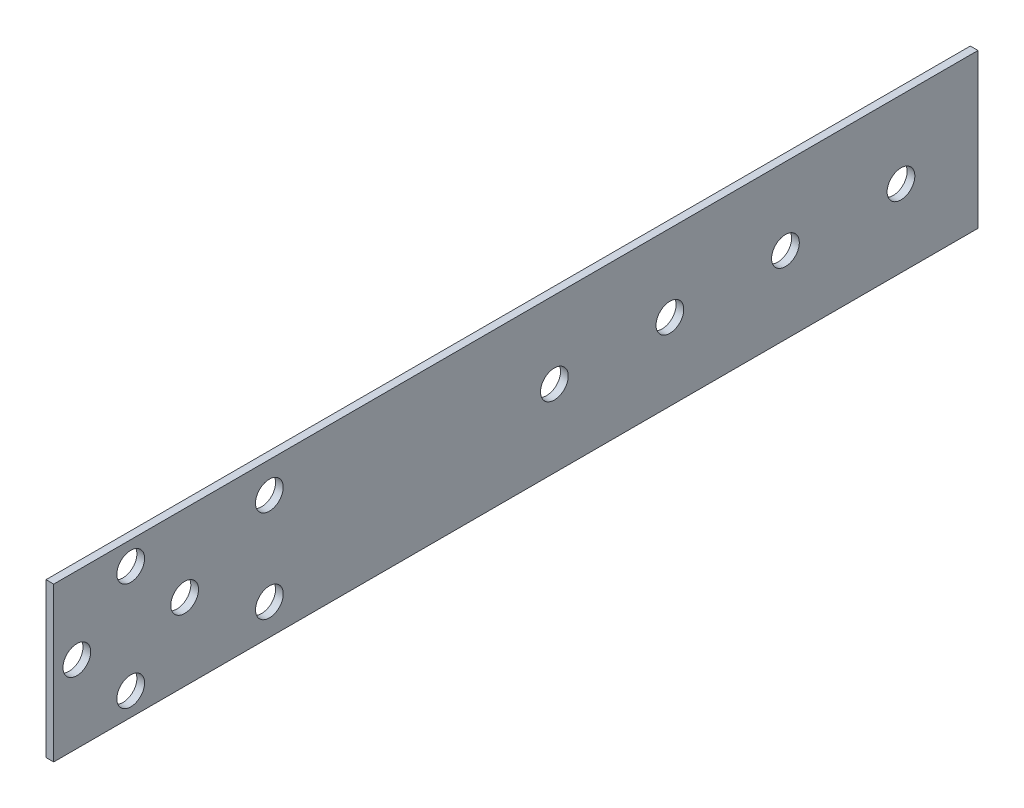
ISO-10303-21;
HEADER;
FILE_DESCRIPTION(('STEP AP214'),'2;1');
FILE_NAME('part.step','',(''),(''),'','','');
FILE_SCHEMA(('AUTOMOTIVE_DESIGN { 1 0 10303 214 1 1 1 1 }'));
ENDSEC;
DATA;
#1=APPLICATION_CONTEXT('core data for automotive mechanical design processes');
#2=APPLICATION_PROTOCOL_DEFINITION('international standard','automotive_design',2000,#1);
#3=PRODUCT_CONTEXT('',#1,'mechanical');
#4=PRODUCT('Part','Part','',(#3));
#5=PRODUCT_RELATED_PRODUCT_CATEGORY('part','',(#4));
#6=PRODUCT_DEFINITION_FORMATION('','',#4);
#7=PRODUCT_DEFINITION_CONTEXT('part definition',#1,'design');
#8=PRODUCT_DEFINITION('design','',#6,#7);
#9=PRODUCT_DEFINITION_SHAPE('','',#8);
#10=(LENGTH_UNIT() NAMED_UNIT(*) SI_UNIT(.MILLI.,.METRE.));
#11=(NAMED_UNIT(*) PLANE_ANGLE_UNIT() SI_UNIT($,.RADIAN.));
#12=(NAMED_UNIT(*) SI_UNIT($,.STERADIAN.) SOLID_ANGLE_UNIT());
#13=UNCERTAINTY_MEASURE_WITH_UNIT(LENGTH_MEASURE(1.E-05),#10,'distance_accuracy_value','');
#14=(GEOMETRIC_REPRESENTATION_CONTEXT(3) GLOBAL_UNCERTAINTY_ASSIGNED_CONTEXT((#13)) GLOBAL_UNIT_ASSIGNED_CONTEXT((#10,
#11,#12)) REPRESENTATION_CONTEXT('',''));
#15=CARTESIAN_POINT('',(0.,0.,0.));
#16=DIRECTION('',(0.,0.,1.));
#17=DIRECTION('',(1.,0.,0.));
#18=AXIS2_PLACEMENT_3D('',#15,#16,#17);
#19=CARTESIAN_POINT('',(0.,20.,0.));
#20=DIRECTION('',(1.,0.,0.));
#21=DIRECTION('',(0.,0.,-1.));
#22=AXIS2_PLACEMENT_3D('',#19,#20,#21);
#23=PLANE('',#22);
#24=CARTESIAN_POINT('',(0.,16.,-28.));
#25=DIRECTION('',(-1.,0.,0.));
#26=DIRECTION('',(0.,0.,1.));
#27=AXIS2_PLACEMENT_3D('',#24,#25,#26);
#28=CIRCLE('',#27,1.8);
#29=CARTESIAN_POINT('',(0.,16.,-26.2));
#30=VERTEX_POINT('',#29);
#31=EDGE_CURVE('E180',#30,#30,#28,.T.);
#32=ORIENTED_EDGE('',*,*,#31,.F.);
#33=EDGE_LOOP('',(#32));
#34=FACE_BOUND('',#33,.T.);
#35=CARTESIAN_POINT('',(0.,4.,-28.));
#36=DIRECTION('',(-1.,0.,0.));
#37=DIRECTION('',(0.,0.,1.));
#38=AXIS2_PLACEMENT_3D('',#35,#36,#37);
#39=CIRCLE('',#38,1.8);
#40=CARTESIAN_POINT('',(0.,4.,-26.2));
#41=VERTEX_POINT('',#40);
#42=EDGE_CURVE('E174',#41,#41,#39,.T.);
#43=ORIENTED_EDGE('',*,*,#42,.F.);
#44=EDGE_LOOP('',(#43));
#45=FACE_BOUND('',#44,.T.);
#46=CARTESIAN_POINT('',(0.,10.,-110.));
#47=DIRECTION('',(-1.,0.,0.));
#48=DIRECTION('',(0.,0.,1.));
#49=AXIS2_PLACEMENT_3D('',#46,#47,#48);
#50=CIRCLE('',#49,1.79999999999999);
#51=CARTESIAN_POINT('',(0.,10.,-108.2));
#52=VERTEX_POINT('',#51);
#53=EDGE_CURVE('E127',#52,#52,#50,.T.);
#54=ORIENTED_EDGE('',*,*,#53,.F.);
#55=EDGE_LOOP('',(#54));
#56=FACE_BOUND('',#55,.T.);
#57=CARTESIAN_POINT('',(0.,10.,-95.));
#58=DIRECTION('',(-1.,0.,0.));
#59=DIRECTION('',(0.,0.,1.));
#60=AXIS2_PLACEMENT_3D('',#57,#58,#59);
#61=CIRCLE('',#60,1.79999999999999);
#62=CARTESIAN_POINT('',(0.,10.,-93.2));
#63=VERTEX_POINT('',#62);
#64=EDGE_CURVE('E169',#63,#63,#61,.T.);
#65=ORIENTED_EDGE('',*,*,#64,.F.);
#66=EDGE_LOOP('',(#65));
#67=FACE_BOUND('',#66,.T.);
#68=CARTESIAN_POINT('',(0.,10.,-80.));
#69=DIRECTION('',(-1.,0.,0.));
#70=DIRECTION('',(0.,0.,1.));
#71=AXIS2_PLACEMENT_3D('',#68,#69,#70);
#72=CIRCLE('',#71,1.80000000000001);
#73=CARTESIAN_POINT('',(0.,10.,-78.2));
#74=VERTEX_POINT('',#73);
#75=EDGE_CURVE('E165',#74,#74,#72,.T.);
#76=ORIENTED_EDGE('',*,*,#75,.F.);
#77=EDGE_LOOP('',(#76));
#78=FACE_BOUND('',#77,.T.);
#79=CARTESIAN_POINT('',(0.,10.,-65.));
#80=DIRECTION('',(-1.,0.,0.));
#81=DIRECTION('',(0.,0.,1.));
#82=AXIS2_PLACEMENT_3D('',#79,#80,#81);
#83=CIRCLE('',#82,1.79999999999999);
#84=CARTESIAN_POINT('',(0.,10.,-63.2));
#85=VERTEX_POINT('',#84);
#86=EDGE_CURVE('E162',#85,#85,#83,.T.);
#87=ORIENTED_EDGE('',*,*,#86,.F.);
#88=EDGE_LOOP('',(#87));
#89=FACE_BOUND('',#88,.T.);
#90=CARTESIAN_POINT('',(0.,17.,-9.99999999999999));
#91=DIRECTION('',(-1.,0.,0.));
#92=DIRECTION('',(0.,0.,1.));
#93=AXIS2_PLACEMENT_3D('',#90,#91,#92);
#94=CIRCLE('',#93,1.8);
#95=CARTESIAN_POINT('',(0.,17.,-8.2));
#96=VERTEX_POINT('',#95);
#97=EDGE_CURVE('E157',#96,#96,#94,.T.);
#98=ORIENTED_EDGE('',*,*,#97,.F.);
#99=EDGE_LOOP('',(#98));
#100=FACE_BOUND('',#99,.T.);
#101=CARTESIAN_POINT('',(0.,10.,-17.));
#102=DIRECTION('',(-1.,0.,0.));
#103=DIRECTION('',(0.,0.,1.));
#104=AXIS2_PLACEMENT_3D('',#101,#102,#103);
#105=CIRCLE('',#104,1.8);
#106=CARTESIAN_POINT('',(0.,10.,-15.2));
#107=VERTEX_POINT('',#106);
#108=EDGE_CURVE('E154',#107,#107,#105,.T.);
#109=ORIENTED_EDGE('',*,*,#108,.F.);
#110=EDGE_LOOP('',(#109));
#111=FACE_BOUND('',#110,.T.);
#112=CARTESIAN_POINT('',(0.,10.,-3.));
#113=DIRECTION('',(-1.,0.,0.));
#114=DIRECTION('',(0.,0.,1.));
#115=AXIS2_PLACEMENT_3D('',#112,#113,#114);
#116=CIRCLE('',#115,1.8);
#117=CARTESIAN_POINT('',(0.,10.,-1.2));
#118=VERTEX_POINT('',#117);
#119=EDGE_CURVE('E148',#118,#118,#116,.T.);
#120=ORIENTED_EDGE('',*,*,#119,.F.);
#121=EDGE_LOOP('',(#120));
#122=FACE_BOUND('',#121,.T.);
#123=CARTESIAN_POINT('',(0.,3.,-9.99999999999999));
#124=DIRECTION('',(-1.,0.,0.));
#125=DIRECTION('',(0.,0.,1.));
#126=AXIS2_PLACEMENT_3D('',#123,#124,#125);
#127=CIRCLE('',#126,1.8);
#128=CARTESIAN_POINT('',(0.,3.,-8.19999999999999));
#129=VERTEX_POINT('',#128);
#130=EDGE_CURVE('E138',#129,#129,#127,.T.);
#131=ORIENTED_EDGE('',*,*,#130,.F.);
#132=EDGE_LOOP('',(#131));
#133=FACE_BOUND('',#132,.T.);
#134=DIRECTION('',(0.,0.,1.));
#135=VECTOR('',#134,1.);
#136=CARTESIAN_POINT('',(0.,0.,0.));
#137=LINE('',#136,#135);
#138=CARTESIAN_POINT('',(0.,0.,-120.));
#139=VERTEX_POINT('',#138);
#140=CARTESIAN_POINT('',(0.,0.,0.));
#141=VERTEX_POINT('',#140);
#142=EDGE_CURVE('E114',#139,#141,#137,.T.);
#143=ORIENTED_EDGE('',*,*,#142,.T.);
#144=DIRECTION('',(0.,-1.,0.));
#145=VECTOR('',#144,1.);
#146=CARTESIAN_POINT('',(0.,20.,0.));
#147=LINE('',#146,#145);
#148=CARTESIAN_POINT('',(0.,20.,0.));
#149=VERTEX_POINT('',#148);
#150=EDGE_CURVE('E12',#149,#141,#147,.T.);
#151=ORIENTED_EDGE('',*,*,#150,.F.);
#152=DIRECTION('',(0.,0.,1.));
#153=VECTOR('',#152,1.);
#154=CARTESIAN_POINT('',(0.,20.,0.));
#155=LINE('',#154,#153);
#156=CARTESIAN_POINT('',(0.,20.,-120.));
#157=VERTEX_POINT('',#156);
#158=EDGE_CURVE('E101',#157,#149,#155,.T.);
#159=ORIENTED_EDGE('',*,*,#158,.F.);
#160=DIRECTION('',(0.,-1.,0.));
#161=VECTOR('',#160,1.);
#162=CARTESIAN_POINT('',(0.,20.,-120.));
#163=LINE('',#162,#161);
#164=EDGE_CURVE('E110',#157,#139,#163,.T.);
#165=ORIENTED_EDGE('',*,*,#164,.T.);
#166=EDGE_LOOP('',(#143,#151,#159,#165));
#167=FACE_BOUND('',#166,.T.);
#168=ADVANCED_FACE('F48',(#34,#45,#56,#67,#78,#89,#100,#111,#122,#133,#167),#23,.F.);
#169=CARTESIAN_POINT('',(0.,20.,0.));
#170=DIRECTION('',(0.,0.,-1.));
#171=DIRECTION('',(-1.,0.,0.));
#172=AXIS2_PLACEMENT_3D('',#169,#170,#171);
#173=PLANE('',#172);
#174=DIRECTION('',(1.,0.,0.));
#175=VECTOR('',#174,1.);
#176=CARTESIAN_POINT('',(0.,0.,0.));
#177=LINE('',#176,#175);
#178=CARTESIAN_POINT('',(1.,0.,0.));
#179=VERTEX_POINT('',#178);
#180=EDGE_CURVE('E105',#141,#179,#177,.T.);
#181=ORIENTED_EDGE('',*,*,#180,.T.);
#182=DIRECTION('',(0.,-1.,0.));
#183=VECTOR('',#182,1.);
#184=CARTESIAN_POINT('',(1.,20.,0.));
#185=LINE('',#184,#183);
#186=CARTESIAN_POINT('',(1.,20.,0.));
#187=VERTEX_POINT('',#186);
#188=EDGE_CURVE('E57',#187,#179,#185,.T.);
#189=ORIENTED_EDGE('',*,*,#188,.F.);
#190=DIRECTION('',(1.,0.,0.));
#191=VECTOR('',#190,1.);
#192=CARTESIAN_POINT('',(0.,20.,0.));
#193=LINE('',#192,#191);
#194=EDGE_CURVE('E96',#149,#187,#193,.T.);
#195=ORIENTED_EDGE('',*,*,#194,.F.);
#196=ORIENTED_EDGE('',*,*,#150,.T.);
#197=EDGE_LOOP('',(#181,#189,#195,#196));
#198=FACE_BOUND('',#197,.T.);
#199=ADVANCED_FACE('F104',(#198),#173,.F.);
#200=CARTESIAN_POINT('',(1.,20.,0.));
#201=DIRECTION('',(-1.,0.,0.));
#202=DIRECTION('',(0.,0.,1.));
#203=AXIS2_PLACEMENT_3D('',#200,#201,#202);
#204=PLANE('',#203);
#205=CARTESIAN_POINT('',(1.,16.,-28.));
#206=DIRECTION('',(-1.,0.,0.));
#207=DIRECTION('',(0.,0.,1.));
#208=AXIS2_PLACEMENT_3D('',#205,#206,#207);
#209=CIRCLE('',#208,1.8);
#210=CARTESIAN_POINT('',(1.,16.,-26.2));
#211=VERTEX_POINT('',#210);
#212=EDGE_CURVE('E166',#211,#211,#209,.T.);
#213=ORIENTED_EDGE('',*,*,#212,.T.);
#214=EDGE_LOOP('',(#213));
#215=FACE_BOUND('',#214,.T.);
#216=CARTESIAN_POINT('',(1.,4.,-28.));
#217=DIRECTION('',(-1.,0.,0.));
#218=DIRECTION('',(0.,0.,1.));
#219=AXIS2_PLACEMENT_3D('',#216,#217,#218);
#220=CIRCLE('',#219,1.8);
#221=CARTESIAN_POINT('',(1.,4.,-26.2));
#222=VERTEX_POINT('',#221);
#223=EDGE_CURVE('E177',#222,#222,#220,.T.);
#224=ORIENTED_EDGE('',*,*,#223,.T.);
#225=EDGE_LOOP('',(#224));
#226=FACE_BOUND('',#225,.T.);
#227=CARTESIAN_POINT('',(0.999999999999999,10.,-110.));
#228=DIRECTION('',(-1.,0.,0.));
#229=DIRECTION('',(0.,0.,1.));
#230=AXIS2_PLACEMENT_3D('',#227,#228,#229);
#231=CIRCLE('',#230,1.79999999999999);
#232=CARTESIAN_POINT('',(0.999999999999999,10.,-108.2));
#233=VERTEX_POINT('',#232);
#234=EDGE_CURVE('E51',#233,#233,#231,.T.);
#235=ORIENTED_EDGE('',*,*,#234,.T.);
#236=EDGE_LOOP('',(#235));
#237=FACE_BOUND('',#236,.T.);
#238=CARTESIAN_POINT('',(0.999999999999999,10.,-95.));
#239=DIRECTION('',(-1.,0.,0.));
#240=DIRECTION('',(0.,0.,1.));
#241=AXIS2_PLACEMENT_3D('',#238,#239,#240);
#242=CIRCLE('',#241,1.79999999999999);
#243=CARTESIAN_POINT('',(0.999999999999999,10.,-93.2));
#244=VERTEX_POINT('',#243);
#245=EDGE_CURVE('E129',#244,#244,#242,.T.);
#246=ORIENTED_EDGE('',*,*,#245,.T.);
#247=EDGE_LOOP('',(#246));
#248=FACE_BOUND('',#247,.T.);
#249=CARTESIAN_POINT('',(0.999999999999999,10.,-80.));
#250=DIRECTION('',(-1.,0.,0.));
#251=DIRECTION('',(0.,0.,1.));
#252=AXIS2_PLACEMENT_3D('',#249,#250,#251);
#253=CIRCLE('',#252,1.80000000000001);
#254=CARTESIAN_POINT('',(0.999999999999999,10.,-78.2));
#255=VERTEX_POINT('',#254);
#256=EDGE_CURVE('E126',#255,#255,#253,.T.);
#257=ORIENTED_EDGE('',*,*,#256,.T.);
#258=EDGE_LOOP('',(#257));
#259=FACE_BOUND('',#258,.T.);
#260=CARTESIAN_POINT('',(0.999999999999999,10.,-65.));
#261=DIRECTION('',(-1.,0.,0.));
#262=DIRECTION('',(0.,0.,1.));
#263=AXIS2_PLACEMENT_3D('',#260,#261,#262);
#264=CIRCLE('',#263,1.79999999999999);
#265=CARTESIAN_POINT('',(0.999999999999999,10.,-63.2));
#266=VERTEX_POINT('',#265);
#267=EDGE_CURVE('E123',#266,#266,#264,.T.);
#268=ORIENTED_EDGE('',*,*,#267,.T.);
#269=EDGE_LOOP('',(#268));
#270=FACE_BOUND('',#269,.T.);
#271=CARTESIAN_POINT('',(1.,17.,-9.99999999999999));
#272=DIRECTION('',(-1.,0.,0.));
#273=DIRECTION('',(0.,0.,1.));
#274=AXIS2_PLACEMENT_3D('',#271,#272,#273);
#275=CIRCLE('',#274,1.8);
#276=CARTESIAN_POINT('',(1.,17.,-8.2));
#277=VERTEX_POINT('',#276);
#278=EDGE_CURVE('E117',#277,#277,#275,.T.);
#279=ORIENTED_EDGE('',*,*,#278,.T.);
#280=EDGE_LOOP('',(#279));
#281=FACE_BOUND('',#280,.T.);
#282=CARTESIAN_POINT('',(1.,10.,-17.));
#283=DIRECTION('',(-1.,0.,0.));
#284=DIRECTION('',(0.,0.,1.));
#285=AXIS2_PLACEMENT_3D('',#282,#283,#284);
#286=CIRCLE('',#285,1.8);
#287=CARTESIAN_POINT('',(1.,10.,-15.2));
#288=VERTEX_POINT('',#287);
#289=EDGE_CURVE('E151',#288,#288,#286,.T.);
#290=ORIENTED_EDGE('',*,*,#289,.T.);
#291=EDGE_LOOP('',(#290));
#292=FACE_BOUND('',#291,.T.);
#293=CARTESIAN_POINT('',(1.,10.,-3.));
#294=DIRECTION('',(-1.,0.,0.));
#295=DIRECTION('',(0.,0.,1.));
#296=AXIS2_PLACEMENT_3D('',#293,#294,#295);
#297=CIRCLE('',#296,1.8);
#298=CARTESIAN_POINT('',(1.,10.,-1.2));
#299=VERTEX_POINT('',#298);
#300=EDGE_CURVE('E143',#299,#299,#297,.T.);
#301=ORIENTED_EDGE('',*,*,#300,.T.);
#302=EDGE_LOOP('',(#301));
#303=FACE_BOUND('',#302,.T.);
#304=CARTESIAN_POINT('',(1.,3.,-9.99999999999999));
#305=DIRECTION('',(-1.,0.,0.));
#306=DIRECTION('',(0.,0.,1.));
#307=AXIS2_PLACEMENT_3D('',#304,#305,#306);
#308=CIRCLE('',#307,1.8);
#309=CARTESIAN_POINT('',(1.,3.,-8.19999999999999));
#310=VERTEX_POINT('',#309);
#311=EDGE_CURVE('E134',#310,#310,#308,.T.);
#312=ORIENTED_EDGE('',*,*,#311,.T.);
#313=EDGE_LOOP('',(#312));
#314=FACE_BOUND('',#313,.T.);
#315=DIRECTION('',(0.,0.,-1.));
#316=VECTOR('',#315,1.);
#317=CARTESIAN_POINT('',(1.,0.,0.));
#318=LINE('',#317,#316);
#319=CARTESIAN_POINT('',(1.,0.,-120.));
#320=VERTEX_POINT('',#319);
#321=EDGE_CURVE('E83',#179,#320,#318,.T.);
#322=ORIENTED_EDGE('',*,*,#321,.T.);
#323=DIRECTION('',(0.,-1.,0.));
#324=VECTOR('',#323,1.);
#325=CARTESIAN_POINT('',(1.,20.,-120.));
#326=LINE('',#325,#324);
#327=CARTESIAN_POINT('',(1.,20.,-120.));
#328=VERTEX_POINT('',#327);
#329=EDGE_CURVE('E106',#328,#320,#326,.T.);
#330=ORIENTED_EDGE('',*,*,#329,.F.);
#331=DIRECTION('',(0.,0.,-1.));
#332=VECTOR('',#331,1.);
#333=CARTESIAN_POINT('',(1.,20.,0.));
#334=LINE('',#333,#332);
#335=EDGE_CURVE('E99',#187,#328,#334,.T.);
#336=ORIENTED_EDGE('',*,*,#335,.F.);
#337=ORIENTED_EDGE('',*,*,#188,.T.);
#338=EDGE_LOOP('',(#322,#330,#336,#337));
#339=FACE_BOUND('',#338,.T.);
#340=ADVANCED_FACE('F108',(#215,#226,#237,#248,#259,#270,#281,#292,#303,#314,#339),#204,.F.);
#341=CARTESIAN_POINT('',(0.,20.,-120.));
#342=DIRECTION('',(0.,0.,1.));
#343=DIRECTION('',(1.,0.,0.));
#344=AXIS2_PLACEMENT_3D('',#341,#342,#343);
#345=PLANE('',#344);
#346=DIRECTION('',(-1.,0.,0.));
#347=VECTOR('',#346,1.);
#348=CARTESIAN_POINT('',(0.,0.,-120.));
#349=LINE('',#348,#347);
#350=EDGE_CURVE('E89',#320,#139,#349,.T.);
#351=ORIENTED_EDGE('',*,*,#350,.T.);
#352=ORIENTED_EDGE('',*,*,#164,.F.);
#353=DIRECTION('',(-1.,0.,0.));
#354=VECTOR('',#353,1.);
#355=CARTESIAN_POINT('',(0.,20.,-120.));
#356=LINE('',#355,#354);
#357=EDGE_CURVE('E66',#328,#157,#356,.T.);
#358=ORIENTED_EDGE('',*,*,#357,.F.);
#359=ORIENTED_EDGE('',*,*,#329,.T.);
#360=EDGE_LOOP('',(#351,#352,#358,#359));
#361=FACE_BOUND('',#360,.T.);
#362=ADVANCED_FACE('F228',(#361),#345,.F.);
#363=CARTESIAN_POINT('',(0.,20.,0.));
#364=DIRECTION('',(0.,-1.,0.));
#365=DIRECTION('',(0.,0.,-1.));
#366=AXIS2_PLACEMENT_3D('',#363,#364,#365);
#367=PLANE('',#366);
#368=ORIENTED_EDGE('',*,*,#158,.T.);
#369=ORIENTED_EDGE('',*,*,#194,.T.);
#370=ORIENTED_EDGE('',*,*,#335,.T.);
#371=ORIENTED_EDGE('',*,*,#357,.T.);
#372=EDGE_LOOP('',(#368,#369,#370,#371));
#373=FACE_BOUND('',#372,.T.);
#374=ADVANCED_FACE('F97',(#373),#367,.F.);
#375=CARTESIAN_POINT('',(0.,0.,0.));
#376=DIRECTION('',(0.,-1.,0.));
#377=DIRECTION('',(0.,0.,-1.));
#378=AXIS2_PLACEMENT_3D('',#375,#376,#377);
#379=PLANE('',#378);
#380=ORIENTED_EDGE('',*,*,#142,.F.);
#381=ORIENTED_EDGE('',*,*,#350,.F.);
#382=ORIENTED_EDGE('',*,*,#321,.F.);
#383=ORIENTED_EDGE('',*,*,#180,.F.);
#384=EDGE_LOOP('',(#380,#381,#382,#383));
#385=FACE_BOUND('',#384,.T.);
#386=ADVANCED_FACE('F217',(#385),#379,.T.);
#387=CARTESIAN_POINT('',(1.,3.,-9.99999999999999));
#388=DIRECTION('',(-1.,0.,0.));
#389=DIRECTION('',(0.,0.,1.));
#390=AXIS2_PLACEMENT_3D('',#387,#388,#389);
#391=CYLINDRICAL_SURFACE('',#390,1.8);
#392=ORIENTED_EDGE('',*,*,#311,.F.);
#393=EDGE_LOOP('',(#392));
#394=FACE_BOUND('',#393,.T.);
#395=ORIENTED_EDGE('',*,*,#130,.T.);
#396=EDGE_LOOP('',(#395));
#397=FACE_BOUND('',#396,.T.);
#398=ADVANCED_FACE('F219',(#394,#397),#391,.F.);
#399=CARTESIAN_POINT('',(1.,10.,-3.));
#400=DIRECTION('',(-1.,0.,0.));
#401=DIRECTION('',(0.,0.,1.));
#402=AXIS2_PLACEMENT_3D('',#399,#400,#401);
#403=CYLINDRICAL_SURFACE('',#402,1.8);
#404=ORIENTED_EDGE('',*,*,#300,.F.);
#405=EDGE_LOOP('',(#404));
#406=FACE_BOUND('',#405,.T.);
#407=ORIENTED_EDGE('',*,*,#119,.T.);
#408=EDGE_LOOP('',(#407));
#409=FACE_BOUND('',#408,.T.);
#410=ADVANCED_FACE('F225',(#406,#409),#403,.F.);
#411=CARTESIAN_POINT('',(1.,10.,-17.));
#412=DIRECTION('',(-1.,0.,0.));
#413=DIRECTION('',(0.,0.,1.));
#414=AXIS2_PLACEMENT_3D('',#411,#412,#413);
#415=CYLINDRICAL_SURFACE('',#414,1.8);
#416=ORIENTED_EDGE('',*,*,#289,.F.);
#417=EDGE_LOOP('',(#416));
#418=FACE_BOUND('',#417,.T.);
#419=ORIENTED_EDGE('',*,*,#108,.T.);
#420=EDGE_LOOP('',(#419));
#421=FACE_BOUND('',#420,.T.);
#422=ADVANCED_FACE('F275',(#418,#421),#415,.F.);
#423=CARTESIAN_POINT('',(1.,17.,-9.99999999999999));
#424=DIRECTION('',(-1.,0.,0.));
#425=DIRECTION('',(0.,0.,1.));
#426=AXIS2_PLACEMENT_3D('',#423,#424,#425);
#427=CYLINDRICAL_SURFACE('',#426,1.8);
#428=ORIENTED_EDGE('',*,*,#278,.F.);
#429=EDGE_LOOP('',(#428));
#430=FACE_BOUND('',#429,.T.);
#431=ORIENTED_EDGE('',*,*,#97,.T.);
#432=EDGE_LOOP('',(#431));
#433=FACE_BOUND('',#432,.T.);
#434=ADVANCED_FACE('F286',(#430,#433),#427,.F.);
#435=CARTESIAN_POINT('',(10.,10.,-65.));
#436=DIRECTION('',(-1.,0.,0.));
#437=DIRECTION('',(0.,0.,1.));
#438=AXIS2_PLACEMENT_3D('',#435,#436,#437);
#439=CYLINDRICAL_SURFACE('',#438,1.79999999999999);
#440=ORIENTED_EDGE('',*,*,#86,.T.);
#441=EDGE_LOOP('',(#440));
#442=FACE_BOUND('',#441,.T.);
#443=ORIENTED_EDGE('',*,*,#267,.F.);
#444=EDGE_LOOP('',(#443));
#445=FACE_BOUND('',#444,.T.);
#446=ADVANCED_FACE('F296',(#442,#445),#439,.F.);
#447=CARTESIAN_POINT('',(10.,10.,-80.));
#448=DIRECTION('',(-1.,0.,0.));
#449=DIRECTION('',(0.,0.,1.));
#450=AXIS2_PLACEMENT_3D('',#447,#448,#449);
#451=CYLINDRICAL_SURFACE('',#450,1.80000000000001);
#452=ORIENTED_EDGE('',*,*,#75,.T.);
#453=EDGE_LOOP('',(#452));
#454=FACE_BOUND('',#453,.T.);
#455=ORIENTED_EDGE('',*,*,#256,.F.);
#456=EDGE_LOOP('',(#455));
#457=FACE_BOUND('',#456,.T.);
#458=ADVANCED_FACE('F306',(#454,#457),#451,.F.);
#459=CARTESIAN_POINT('',(10.,10.,-95.));
#460=DIRECTION('',(-1.,0.,0.));
#461=DIRECTION('',(0.,0.,1.));
#462=AXIS2_PLACEMENT_3D('',#459,#460,#461);
#463=CYLINDRICAL_SURFACE('',#462,1.79999999999999);
#464=ORIENTED_EDGE('',*,*,#64,.T.);
#465=EDGE_LOOP('',(#464));
#466=FACE_BOUND('',#465,.T.);
#467=ORIENTED_EDGE('',*,*,#245,.F.);
#468=EDGE_LOOP('',(#467));
#469=FACE_BOUND('',#468,.T.);
#470=ADVANCED_FACE('F316',(#466,#469),#463,.F.);
#471=CARTESIAN_POINT('',(10.,10.,-110.));
#472=DIRECTION('',(-1.,0.,0.));
#473=DIRECTION('',(0.,0.,1.));
#474=AXIS2_PLACEMENT_3D('',#471,#472,#473);
#475=CYLINDRICAL_SURFACE('',#474,1.79999999999999);
#476=ORIENTED_EDGE('',*,*,#53,.T.);
#477=EDGE_LOOP('',(#476));
#478=FACE_BOUND('',#477,.T.);
#479=ORIENTED_EDGE('',*,*,#234,.F.);
#480=EDGE_LOOP('',(#479));
#481=FACE_BOUND('',#480,.T.);
#482=ADVANCED_FACE('F326',(#478,#481),#475,.F.);
#483=CARTESIAN_POINT('',(1.,4.,-28.));
#484=DIRECTION('',(-1.,0.,0.));
#485=DIRECTION('',(0.,0.,1.));
#486=AXIS2_PLACEMENT_3D('',#483,#484,#485);
#487=CYLINDRICAL_SURFACE('',#486,1.8);
#488=ORIENTED_EDGE('',*,*,#223,.F.);
#489=EDGE_LOOP('',(#488));
#490=FACE_BOUND('',#489,.T.);
#491=ORIENTED_EDGE('',*,*,#42,.T.);
#492=EDGE_LOOP('',(#491));
#493=FACE_BOUND('',#492,.T.);
#494=ADVANCED_FACE('F191',(#490,#493),#487,.F.);
#495=CARTESIAN_POINT('',(1.,16.,-28.));
#496=DIRECTION('',(-1.,0.,0.));
#497=DIRECTION('',(0.,0.,1.));
#498=AXIS2_PLACEMENT_3D('',#495,#496,#497);
#499=CYLINDRICAL_SURFACE('',#498,1.8);
#500=ORIENTED_EDGE('',*,*,#212,.F.);
#501=EDGE_LOOP('',(#500));
#502=FACE_BOUND('',#501,.T.);
#503=ORIENTED_EDGE('',*,*,#31,.T.);
#504=EDGE_LOOP('',(#503));
#505=FACE_BOUND('',#504,.T.);
#506=ADVANCED_FACE('F188',(#502,#505),#499,.F.);
#507=CLOSED_SHELL('',(#168,#199,#340,#362,#374,#386,#398,#410,#422,#434,#446,#458,#470,#482,
#494,#506));
#508=MANIFOLD_SOLID_BREP('B2',#507);
#509=ADVANCED_BREP_SHAPE_REPRESENTATION('',(#18,#508),#14);
#510=SHAPE_DEFINITION_REPRESENTATION(#9,#509);
ENDSEC;
END-ISO-10303-21;
